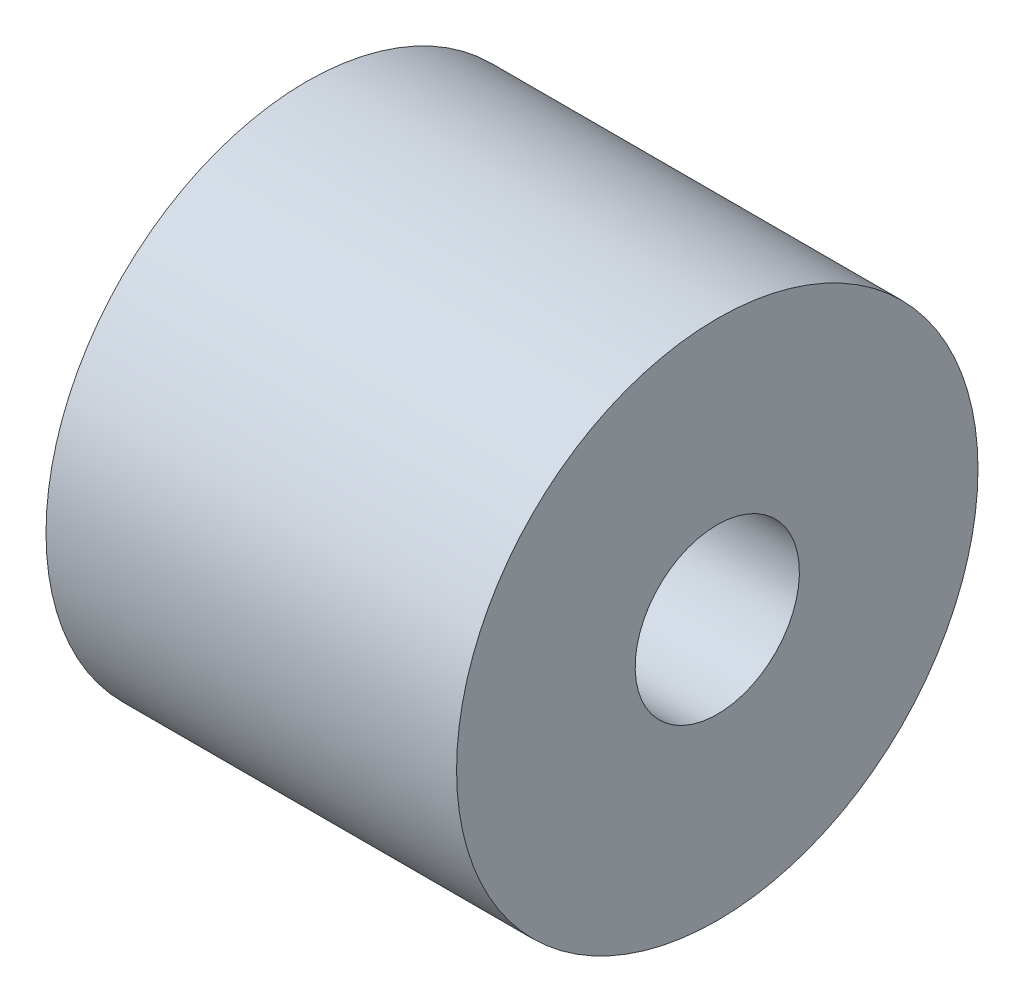
ISO-10303-21;
HEADER;
FILE_DESCRIPTION(('STEP AP214'),'2;1');
FILE_NAME('part.step','',(''),(''),'','','');
FILE_SCHEMA(('AUTOMOTIVE_DESIGN { 1 0 10303 214 1 1 1 1 }'));
ENDSEC;
DATA;
#1=APPLICATION_CONTEXT('core data for automotive mechanical design processes');
#2=APPLICATION_PROTOCOL_DEFINITION('international standard','automotive_design',2000,#1);
#3=PRODUCT_CONTEXT('',#1,'mechanical');
#4=PRODUCT('Part','Part','',(#3));
#5=PRODUCT_RELATED_PRODUCT_CATEGORY('part','',(#4));
#6=PRODUCT_DEFINITION_FORMATION('','',#4);
#7=PRODUCT_DEFINITION_CONTEXT('part definition',#1,'design');
#8=PRODUCT_DEFINITION('design','',#6,#7);
#9=PRODUCT_DEFINITION_SHAPE('','',#8);
#10=(LENGTH_UNIT() NAMED_UNIT(*) SI_UNIT(.MILLI.,.METRE.));
#11=(NAMED_UNIT(*) PLANE_ANGLE_UNIT() SI_UNIT($,.RADIAN.));
#12=(NAMED_UNIT(*) SI_UNIT($,.STERADIAN.) SOLID_ANGLE_UNIT());
#13=UNCERTAINTY_MEASURE_WITH_UNIT(LENGTH_MEASURE(1.E-05),#10,'distance_accuracy_value','');
#14=(GEOMETRIC_REPRESENTATION_CONTEXT(3) GLOBAL_UNCERTAINTY_ASSIGNED_CONTEXT((#13)) GLOBAL_UNIT_ASSIGNED_CONTEXT((#10,
#11,#12)) REPRESENTATION_CONTEXT('',''));
#15=CARTESIAN_POINT('',(0.,0.,0.));
#16=DIRECTION('',(0.,0.,1.));
#17=DIRECTION('',(1.,0.,0.));
#18=AXIS2_PLACEMENT_3D('',#15,#16,#17);
#19=CARTESIAN_POINT('',(-140.403171357252,39.0096237558063,120.908236412381));
#20=DIRECTION('',(1.,0.,0.));
#21=DIRECTION('',(0.,1.,0.));
#22=AXIS2_PLACEMENT_3D('',#19,#20,#21);
#23=CYLINDRICAL_SURFACE('',#22,6.34999999999975);
#24=CARTESIAN_POINT('',(-140.403171357252,39.0096237558063,120.908236412381));
#25=DIRECTION('',(1.,0.,0.));
#26=DIRECTION('',(0.,1.,0.));
#27=AXIS2_PLACEMENT_3D('',#24,#25,#26);
#28=CIRCLE('',#27,6.34999999999975);
#29=CARTESIAN_POINT('',(-140.403171357252,45.359623755806,120.908236412381));
#30=VERTEX_POINT('',#29);
#31=EDGE_CURVE('E10',#30,#30,#28,.T.);
#32=ORIENTED_EDGE('',*,*,#31,.T.);
#33=EDGE_LOOP('',(#32));
#34=FACE_BOUND('',#33,.T.);
#35=CARTESIAN_POINT('',(-130.403171357252,39.0096237558063,120.908236412381));
#36=DIRECTION('',(1.,0.,0.));
#37=DIRECTION('',(0.,1.,0.));
#38=AXIS2_PLACEMENT_3D('',#35,#36,#37);
#39=CIRCLE('',#38,6.34999999999975);
#40=CARTESIAN_POINT('',(-130.403171357252,45.359623755806,120.908236412381));
#41=VERTEX_POINT('',#40);
#42=EDGE_CURVE('E34',#41,#41,#39,.T.);
#43=ORIENTED_EDGE('',*,*,#42,.F.);
#44=EDGE_LOOP('',(#43));
#45=FACE_BOUND('',#44,.T.);
#46=ADVANCED_FACE('F31',(#34,#45),#23,.T.);
#47=CARTESIAN_POINT('',(-140.403171357252,39.0096237558063,120.908236412381));
#48=DIRECTION('',(1.,0.,0.));
#49=DIRECTION('',(0.,1.,0.));
#50=AXIS2_PLACEMENT_3D('',#47,#48,#49);
#51=PLANE('',#50);
#52=CARTESIAN_POINT('',(-140.403171357252,39.0096237558063,120.908236412381));
#53=DIRECTION('',(1.,0.,0.));
#54=DIRECTION('',(0.,1.,0.));
#55=AXIS2_PLACEMENT_3D('',#52,#53,#54);
#56=CIRCLE('',#55,1.99999999999975);
#57=CARTESIAN_POINT('',(-140.403171357252,41.0096237558061,120.908236412381));
#58=VERTEX_POINT('',#57);
#59=EDGE_CURVE('E41',#58,#58,#56,.T.);
#60=ORIENTED_EDGE('',*,*,#59,.T.);
#61=EDGE_LOOP('',(#60));
#62=FACE_BOUND('',#61,.T.);
#63=ORIENTED_EDGE('',*,*,#31,.F.);
#64=EDGE_LOOP('',(#63));
#65=FACE_BOUND('',#64,.T.);
#66=ADVANCED_FACE('F49',(#62,#65),#51,.F.);
#67=CARTESIAN_POINT('',(-130.403171357252,39.0096237558063,120.908236412381));
#68=DIRECTION('',(1.,0.,0.));
#69=DIRECTION('',(0.,1.,0.));
#70=AXIS2_PLACEMENT_3D('',#67,#68,#69);
#71=PLANE('',#70);
#72=CARTESIAN_POINT('',(-130.403171357252,39.0096237558063,120.908236412381));
#73=DIRECTION('',(1.,0.,0.));
#74=DIRECTION('',(0.,1.,0.));
#75=AXIS2_PLACEMENT_3D('',#72,#73,#74);
#76=CIRCLE('',#75,1.99999999999975);
#77=CARTESIAN_POINT('',(-130.403171357252,41.0096237558061,120.908236412381));
#78=VERTEX_POINT('',#77);
#79=EDGE_CURVE('E43',#78,#78,#76,.T.);
#80=ORIENTED_EDGE('',*,*,#79,.F.);
#81=EDGE_LOOP('',(#80));
#82=FACE_BOUND('',#81,.T.);
#83=ORIENTED_EDGE('',*,*,#42,.T.);
#84=EDGE_LOOP('',(#83));
#85=FACE_BOUND('',#84,.T.);
#86=ADVANCED_FACE('F55',(#82,#85),#71,.T.);
#87=CARTESIAN_POINT('',(-140.403171357252,39.0096237558063,120.908236412381));
#88=DIRECTION('',(1.,0.,0.));
#89=DIRECTION('',(0.,1.,0.));
#90=AXIS2_PLACEMENT_3D('',#87,#88,#89);
#91=CYLINDRICAL_SURFACE('',#90,1.99999999999975);
#92=ORIENTED_EDGE('',*,*,#59,.F.);
#93=EDGE_LOOP('',(#92));
#94=FACE_BOUND('',#93,.T.);
#95=ORIENTED_EDGE('',*,*,#79,.T.);
#96=EDGE_LOOP('',(#95));
#97=FACE_BOUND('',#96,.T.);
#98=ADVANCED_FACE('F52',(#94,#97),#91,.F.);
#99=CLOSED_SHELL('',(#46,#66,#86,#98));
#100=MANIFOLD_SOLID_BREP('B2',#99);
#101=ADVANCED_BREP_SHAPE_REPRESENTATION('',(#18,#100),#14);
#102=SHAPE_DEFINITION_REPRESENTATION(#9,#101);
ENDSEC;
END-ISO-10303-21;
